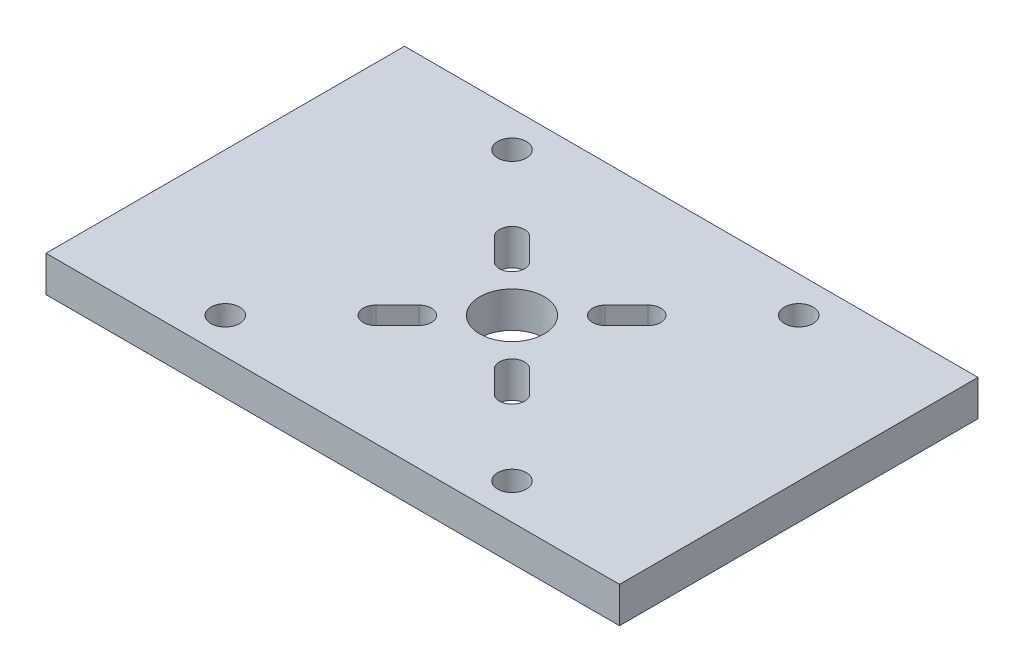
ISO-10303-21;
HEADER;
FILE_DESCRIPTION(('STEP AP214'),'2;1');
FILE_NAME('part.step','',(''),(''),'','','');
FILE_SCHEMA(('AUTOMOTIVE_DESIGN { 1 0 10303 214 1 1 1 1 }'));
ENDSEC;
DATA;
#1=APPLICATION_CONTEXT('core data for automotive mechanical design processes');
#2=APPLICATION_PROTOCOL_DEFINITION('international standard','automotive_design',2000,#1);
#3=PRODUCT_CONTEXT('',#1,'mechanical');
#4=PRODUCT('Part','Part','',(#3));
#5=PRODUCT_RELATED_PRODUCT_CATEGORY('part','',(#4));
#6=PRODUCT_DEFINITION_FORMATION('','',#4);
#7=PRODUCT_DEFINITION_CONTEXT('part definition',#1,'design');
#8=PRODUCT_DEFINITION('design','',#6,#7);
#9=PRODUCT_DEFINITION_SHAPE('','',#8);
#10=(LENGTH_UNIT() NAMED_UNIT(*) SI_UNIT(.MILLI.,.METRE.));
#11=(NAMED_UNIT(*) PLANE_ANGLE_UNIT() SI_UNIT($,.RADIAN.));
#12=(NAMED_UNIT(*) SI_UNIT($,.STERADIAN.) SOLID_ANGLE_UNIT());
#13=UNCERTAINTY_MEASURE_WITH_UNIT(LENGTH_MEASURE(1.E-05),#10,'distance_accuracy_value','');
#14=(GEOMETRIC_REPRESENTATION_CONTEXT(3) GLOBAL_UNCERTAINTY_ASSIGNED_CONTEXT((#13)) GLOBAL_UNIT_ASSIGNED_CONTEXT((#10,
#11,#12)) REPRESENTATION_CONTEXT('',''));
#15=CARTESIAN_POINT('',(0.,0.,0.));
#16=DIRECTION('',(0.,0.,1.));
#17=DIRECTION('',(1.,0.,0.));
#18=AXIS2_PLACEMENT_3D('',#15,#16,#17);
#19=CARTESIAN_POINT('',(0.,0.,0.));
#20=DIRECTION('',(0.,-1.,0.));
#21=DIRECTION('',(0.,0.,-1.));
#22=AXIS2_PLACEMENT_3D('',#19,#20,#21);
#23=PLANE('',#22);
#24=CARTESIAN_POINT('',(-40.,0.,-40.));
#25=DIRECTION('',(0.,-1.,0.));
#26=DIRECTION('',(0.,0.,-1.));
#27=AXIS2_PLACEMENT_3D('',#24,#25,#26);
#28=CIRCLE('',#27,4.);
#29=CARTESIAN_POINT('',(-40.,0.,-44.));
#30=VERTEX_POINT('',#29);
#31=EDGE_CURVE('E736',#30,#30,#28,.T.);
#32=ORIENTED_EDGE('',*,*,#31,.F.);
#33=EDGE_LOOP('',(#32));
#34=FACE_BOUND('',#33,.T.);
#35=CARTESIAN_POINT('',(40.,0.,-40.));
#36=DIRECTION('',(0.,-1.,0.));
#37=DIRECTION('',(0.,0.,-1.));
#38=AXIS2_PLACEMENT_3D('',#35,#36,#37);
#39=CIRCLE('',#38,4.);
#40=CARTESIAN_POINT('',(40.,0.,-44.));
#41=VERTEX_POINT('',#40);
#42=EDGE_CURVE('E738',#41,#41,#39,.T.);
#43=ORIENTED_EDGE('',*,*,#42,.F.);
#44=EDGE_LOOP('',(#43));
#45=FACE_BOUND('',#44,.T.);
#46=CARTESIAN_POINT('',(40.,0.,40.));
#47=DIRECTION('',(0.,-1.,0.));
#48=DIRECTION('',(0.,0.,-1.));
#49=AXIS2_PLACEMENT_3D('',#46,#47,#48);
#50=CIRCLE('',#49,4.);
#51=CARTESIAN_POINT('',(40.,0.,36.));
#52=VERTEX_POINT('',#51);
#53=EDGE_CURVE('E753',#52,#52,#50,.T.);
#54=ORIENTED_EDGE('',*,*,#53,.F.);
#55=EDGE_LOOP('',(#54));
#56=FACE_BOUND('',#55,.T.);
#57=CARTESIAN_POINT('',(-40.,0.,40.));
#58=DIRECTION('',(0.,-1.,0.));
#59=DIRECTION('',(0.,0.,-1.));
#60=AXIS2_PLACEMENT_3D('',#57,#58,#59);
#61=CIRCLE('',#60,4.);
#62=CARTESIAN_POINT('',(-40.,0.,36.));
#63=VERTEX_POINT('',#62);
#64=EDGE_CURVE('E744',#63,#63,#61,.T.);
#65=ORIENTED_EDGE('',*,*,#64,.F.);
#66=EDGE_LOOP('',(#65));
#67=FACE_BOUND('',#66,.T.);
#68=DIRECTION('',(0.707106781186549,0.,0.707106781186546));
#69=VECTOR('',#68,1.);
#70=CARTESIAN_POINT('',(-4.24264068711925,0.,4.24264068711926));
#71=LINE('',#70,#69);
#72=CARTESIAN_POINT('',(-23.2426406871193,0.,-14.7573593128807));
#73=VERTEX_POINT('',#72);
#74=CARTESIAN_POINT('',(-17.2426406871193,0.,-8.75735931288071));
#75=VERTEX_POINT('',#74);
#76=EDGE_CURVE('E433',#73,#75,#71,.T.);
#77=ORIENTED_EDGE('',*,*,#76,.T.);
#78=CARTESIAN_POINT('',(-13.,0.,-13.));
#79=DIRECTION('',(0.,-1.,0.));
#80=DIRECTION('',(0.,0.,-1.));
#81=AXIS2_PLACEMENT_3D('',#78,#79,#80);
#82=CIRCLE('',#81,6.);
#83=CARTESIAN_POINT('',(-8.75735931288069,0.,-17.2426406871193));
#84=VERTEX_POINT('',#83);
#85=EDGE_CURVE('E437',#75,#84,#82,.F.);
#86=ORIENTED_EDGE('',*,*,#85,.T.);
#87=DIRECTION('',(-0.707106781186548,0.,-0.707106781186548));
#88=VECTOR('',#87,1.);
#89=CARTESIAN_POINT('',(4.2426406871193,0.,-4.2426406871193));
#90=LINE('',#89,#88);
#91=CARTESIAN_POINT('',(-14.7573593128807,0.,-23.2426406871193));
#92=VERTEX_POINT('',#91);
#93=EDGE_CURVE('E425',#84,#92,#90,.T.);
#94=ORIENTED_EDGE('',*,*,#93,.T.);
#95=CARTESIAN_POINT('',(-19.,0.,-19.));
#96=DIRECTION('',(0.,-1.,0.));
#97=DIRECTION('',(0.,0.,-1.));
#98=AXIS2_PLACEMENT_3D('',#95,#96,#97);
#99=CIRCLE('',#98,6.00000000000001);
#100=EDGE_CURVE('E429',#92,#73,#99,.F.);
#101=ORIENTED_EDGE('',*,*,#100,.T.);
#102=EDGE_LOOP('',(#77,#86,#94,#101));
#103=FACE_BOUND('',#102,.T.);
#104=DIRECTION('',(0.707106781186548,0.,0.707106781186547));
#105=VECTOR('',#104,1.);
#106=CARTESIAN_POINT('',(-4.24264068711931,0.,4.24264068711931));
#107=LINE('',#106,#105);
#108=CARTESIAN_POINT('',(8.75735931288068,0.,17.2426406871193));
#109=VERTEX_POINT('',#108);
#110=CARTESIAN_POINT('',(14.7573593128807,0.,23.2426406871193));
#111=VERTEX_POINT('',#110);
#112=EDGE_CURVE('E403',#109,#111,#107,.T.);
#113=ORIENTED_EDGE('',*,*,#112,.T.);
#114=CARTESIAN_POINT('',(19.,0.,19.));
#115=DIRECTION('',(0.,-1.,0.));
#116=DIRECTION('',(0.,0.,-1.));
#117=AXIS2_PLACEMENT_3D('',#114,#115,#116);
#118=CIRCLE('',#117,6.);
#119=CARTESIAN_POINT('',(23.2426406871193,0.,14.7573593128807));
#120=VERTEX_POINT('',#119);
#121=EDGE_CURVE('E407',#111,#120,#118,.F.);
#122=ORIENTED_EDGE('',*,*,#121,.T.);
#123=DIRECTION('',(-0.707106781186548,0.,-0.707106781186548));
#124=VECTOR('',#123,1.);
#125=CARTESIAN_POINT('',(4.24264068711927,0.,-4.24264068711927));
#126=LINE('',#125,#124);
#127=CARTESIAN_POINT('',(17.2426406871193,0.,8.75735931288072));
#128=VERTEX_POINT('',#127);
#129=EDGE_CURVE('E387',#120,#128,#126,.T.);
#130=ORIENTED_EDGE('',*,*,#129,.T.);
#131=CARTESIAN_POINT('',(13.,0.,13.));
#132=DIRECTION('',(0.,-1.,0.));
#133=DIRECTION('',(0.,0.,-1.));
#134=AXIS2_PLACEMENT_3D('',#131,#132,#133);
#135=CIRCLE('',#134,6.00000000000001);
#136=EDGE_CURVE('E399',#128,#109,#135,.F.);
#137=ORIENTED_EDGE('',*,*,#136,.T.);
#138=EDGE_LOOP('',(#113,#122,#130,#137));
#139=FACE_BOUND('',#138,.T.);
#140=CARTESIAN_POINT('',(0.,0.,0.));
#141=DIRECTION('',(0.,-1.,0.));
#142=DIRECTION('',(0.,0.,-1.));
#143=AXIS2_PLACEMENT_3D('',#140,#141,#142);
#144=CIRCLE('',#143,9.);
#145=CARTESIAN_POINT('',(0.,0.,-9.));
#146=VERTEX_POINT('',#145);
#147=EDGE_CURVE('E362',#146,#146,#144,.T.);
#148=ORIENTED_EDGE('',*,*,#147,.F.);
#149=EDGE_LOOP('',(#148));
#150=FACE_BOUND('',#149,.T.);
#151=DIRECTION('',(0.,0.,1.));
#152=VECTOR('',#151,1.);
#153=CARTESIAN_POINT('',(80.,0.,-50.));
#154=LINE('',#153,#152);
#155=CARTESIAN_POINT('',(80.,0.,-50.));
#156=VERTEX_POINT('',#155);
#157=CARTESIAN_POINT('',(80.,0.,50.));
#158=VERTEX_POINT('',#157);
#159=EDGE_CURVE('E375',#156,#158,#154,.T.);
#160=ORIENTED_EDGE('',*,*,#159,.T.);
#161=DIRECTION('',(-1.,0.,0.));
#162=VECTOR('',#161,1.);
#163=CARTESIAN_POINT('',(80.,0.,50.));
#164=LINE('',#163,#162);
#165=CARTESIAN_POINT('',(-80.,0.,50.));
#166=VERTEX_POINT('',#165);
#167=EDGE_CURVE('E378',#158,#166,#164,.T.);
#168=ORIENTED_EDGE('',*,*,#167,.T.);
#169=DIRECTION('',(0.,0.,1.));
#170=VECTOR('',#169,1.);
#171=CARTESIAN_POINT('',(-80.,0.,-50.));
#172=LINE('',#171,#170);
#173=CARTESIAN_POINT('',(-80.,0.,-50.));
#174=VERTEX_POINT('',#173);
#175=EDGE_CURVE('E381',#174,#166,#172,.T.);
#176=ORIENTED_EDGE('',*,*,#175,.F.);
#177=DIRECTION('',(-1.,0.,0.));
#178=VECTOR('',#177,1.);
#179=CARTESIAN_POINT('',(80.,0.,-50.));
#180=LINE('',#179,#178);
#181=EDGE_CURVE('E367',#156,#174,#180,.T.);
#182=ORIENTED_EDGE('',*,*,#181,.F.);
#183=EDGE_LOOP('',(#160,#168,#176,#182));
#184=FACE_BOUND('',#183,.T.);
#185=DIRECTION('',(0.707106781186548,0.,-0.707106781186547));
#186=VECTOR('',#185,1.);
#187=CARTESIAN_POINT('',(4.24264068711932,0.,4.24264068711933));
#188=LINE('',#187,#186);
#189=CARTESIAN_POINT('',(-14.7573593128807,0.,23.2426406871193));
#190=VERTEX_POINT('',#189);
#191=CARTESIAN_POINT('',(-8.75735931288068,0.,17.2426406871193));
#192=VERTEX_POINT('',#191);
#193=EDGE_CURVE('E418',#190,#192,#188,.T.);
#194=ORIENTED_EDGE('',*,*,#193,.T.);
#195=CARTESIAN_POINT('',(-13.,0.,13.));
#196=DIRECTION('',(0.,-1.,0.));
#197=DIRECTION('',(0.,0.,-1.));
#198=AXIS2_PLACEMENT_3D('',#195,#196,#197);
#199=CIRCLE('',#198,6.00000000000001);
#200=CARTESIAN_POINT('',(-17.2426406871193,0.,8.75735931288071));
#201=VERTEX_POINT('',#200);
#202=EDGE_CURVE('E422',#192,#201,#199,.F.);
#203=ORIENTED_EDGE('',*,*,#202,.T.);
#204=DIRECTION('',(-0.707106781186547,0.,0.707106781186548));
#205=VECTOR('',#204,1.);
#206=CARTESIAN_POINT('',(-4.24264068711928,0.,-4.24264068711928));
#207=LINE('',#206,#205);
#208=CARTESIAN_POINT('',(-23.2426406871193,0.,14.7573593128807));
#209=VERTEX_POINT('',#208);
#210=EDGE_CURVE('E410',#201,#209,#207,.T.);
#211=ORIENTED_EDGE('',*,*,#210,.T.);
#212=CARTESIAN_POINT('',(-19.,0.,19.));
#213=DIRECTION('',(0.,-1.,0.));
#214=DIRECTION('',(0.,0.,-1.));
#215=AXIS2_PLACEMENT_3D('',#212,#213,#214);
#216=CIRCLE('',#215,6.);
#217=EDGE_CURVE('E414',#209,#190,#216,.F.);
#218=ORIENTED_EDGE('',*,*,#217,.T.);
#219=EDGE_LOOP('',(#194,#203,#211,#218));
#220=FACE_BOUND('',#219,.T.);
#221=DIRECTION('',(0.707106781186548,0.,-0.707106781186547));
#222=VECTOR('',#221,1.);
#223=CARTESIAN_POINT('',(4.24264068711927,0.,4.24264068711927));
#224=LINE('',#223,#222);
#225=CARTESIAN_POINT('',(17.2426406871193,0.,-8.75735931288072));
#226=VERTEX_POINT('',#225);
#227=CARTESIAN_POINT('',(23.2426406871193,0.,-14.7573593128807));
#228=VERTEX_POINT('',#227);
#229=EDGE_CURVE('E49',#226,#228,#224,.T.);
#230=ORIENTED_EDGE('',*,*,#229,.T.);
#231=CARTESIAN_POINT('',(19.,0.,-19.));
#232=DIRECTION('',(0.,-1.,0.));
#233=DIRECTION('',(0.,0.,-1.));
#234=AXIS2_PLACEMENT_3D('',#231,#232,#233);
#235=CIRCLE('',#234,6.00000000000001);
#236=CARTESIAN_POINT('',(14.7573593128807,0.,-23.2426406871193));
#237=VERTEX_POINT('',#236);
#238=EDGE_CURVE('E11',#228,#237,#235,.F.);
#239=ORIENTED_EDGE('',*,*,#238,.T.);
#240=DIRECTION('',(-0.707106781186547,0.,0.707106781186548));
#241=VECTOR('',#240,1.);
#242=CARTESIAN_POINT('',(-4.2426406871193,0.,-4.2426406871193));
#243=LINE('',#242,#241);
#244=CARTESIAN_POINT('',(8.75735931288068,0.,-17.2426406871193));
#245=VERTEX_POINT('',#244);
#246=EDGE_CURVE('E440',#237,#245,#243,.T.);
#247=ORIENTED_EDGE('',*,*,#246,.T.);
#248=CARTESIAN_POINT('',(13.,0.,-13.));
#249=DIRECTION('',(0.,-1.,0.));
#250=DIRECTION('',(0.,0.,-1.));
#251=AXIS2_PLACEMENT_3D('',#248,#249,#250);
#252=CIRCLE('',#251,6.00000000000001);
#253=EDGE_CURVE('E444',#245,#226,#252,.F.);
#254=ORIENTED_EDGE('',*,*,#253,.T.);
#255=EDGE_LOOP('',(#230,#239,#247,#254));
#256=FACE_BOUND('',#255,.T.);
#257=ADVANCED_FACE('F40',(#34,#45,#56,#67,#103,#139,#150,#184,#220,#256),#23,.T.);
#258=ORIENTED_EDGE('',*,*,#238,.F.);
#259=ORIENTED_EDGE('',*,*,#229,.F.);
#260=ORIENTED_EDGE('',*,*,#253,.F.);
#261=ORIENTED_EDGE('',*,*,#246,.F.);
#262=EDGE_LOOP('',(#258,#259,#260,#261));
#263=FACE_BOUND('',#262,.T.);
#264=CARTESIAN_POINT('',(19.,0.,-19.));
#265=DIRECTION('',(0.,-1.,0.));
#266=DIRECTION('',(0.,0.,-1.));
#267=AXIS2_PLACEMENT_3D('',#264,#265,#266);
#268=CIRCLE('',#267,3.50000000000001);
#269=CARTESIAN_POINT('',(21.4748737341529,0.,-16.5251262658471));
#270=VERTEX_POINT('',#269);
#271=CARTESIAN_POINT('',(16.5251262658471,0.,-21.4748737341529));
#272=VERTEX_POINT('',#271);
#273=EDGE_CURVE('E270',#270,#272,#268,.F.);
#274=ORIENTED_EDGE('',*,*,#273,.T.);
#275=DIRECTION('',(-0.707106781186547,0.,0.707106781186548));
#276=VECTOR('',#275,1.);
#277=CARTESIAN_POINT('',(16.5251262658471,0.,-21.4748737341529));
#278=LINE('',#277,#276);
#279=CARTESIAN_POINT('',(10.5251262658471,0.,-15.4748737341529));
#280=VERTEX_POINT('',#279);
#281=EDGE_CURVE('E287',#272,#280,#278,.T.);
#282=ORIENTED_EDGE('',*,*,#281,.T.);
#283=CARTESIAN_POINT('',(13.,0.,-13.));
#284=DIRECTION('',(0.,-1.,0.));
#285=DIRECTION('',(0.,0.,-1.));
#286=AXIS2_PLACEMENT_3D('',#283,#284,#285);
#287=CIRCLE('',#286,3.5);
#288=CARTESIAN_POINT('',(15.4748737341529,0.,-10.5251262658471));
#289=VERTEX_POINT('',#288);
#290=EDGE_CURVE('E263',#280,#289,#287,.F.);
#291=ORIENTED_EDGE('',*,*,#290,.T.);
#292=DIRECTION('',(0.707106781186547,0.,-0.707106781186548));
#293=VECTOR('',#292,1.);
#294=CARTESIAN_POINT('',(21.4748737341529,0.,-16.5251262658471));
#295=LINE('',#294,#293);
#296=EDGE_CURVE('E266',#289,#270,#295,.T.);
#297=ORIENTED_EDGE('',*,*,#296,.T.);
#298=EDGE_LOOP('',(#274,#282,#291,#297));
#299=FACE_BOUND('',#298,.T.);
#300=ADVANCED_FACE('F450',(#263,#299),#23,.T.);
#301=ORIENTED_EDGE('',*,*,#85,.F.);
#302=ORIENTED_EDGE('',*,*,#76,.F.);
#303=ORIENTED_EDGE('',*,*,#100,.F.);
#304=ORIENTED_EDGE('',*,*,#93,.F.);
#305=EDGE_LOOP('',(#301,#302,#303,#304));
#306=FACE_BOUND('',#305,.T.);
#307=CARTESIAN_POINT('',(-19.,0.,-19.));
#308=DIRECTION('',(0.,-1.,0.));
#309=DIRECTION('',(0.,0.,-1.));
#310=AXIS2_PLACEMENT_3D('',#307,#308,#309);
#311=CIRCLE('',#310,3.50000000000001);
#312=CARTESIAN_POINT('',(-16.5251262658471,0.,-21.4748737341529));
#313=VERTEX_POINT('',#312);
#314=CARTESIAN_POINT('',(-21.4748737341529,0.,-16.5251262658471));
#315=VERTEX_POINT('',#314);
#316=EDGE_CURVE('E303',#313,#315,#311,.F.);
#317=ORIENTED_EDGE('',*,*,#316,.T.);
#318=DIRECTION('',(0.707106781186547,0.,0.707106781186548));
#319=VECTOR('',#318,1.);
#320=CARTESIAN_POINT('',(-21.4748737341529,0.,-16.5251262658471));
#321=LINE('',#320,#319);
#322=CARTESIAN_POINT('',(-15.4748737341529,0.,-10.5251262658471));
#323=VERTEX_POINT('',#322);
#324=EDGE_CURVE('E267',#315,#323,#321,.T.);
#325=ORIENTED_EDGE('',*,*,#324,.T.);
#326=CARTESIAN_POINT('',(-13.,0.,-13.));
#327=DIRECTION('',(0.,-1.,0.));
#328=DIRECTION('',(0.,0.,-1.));
#329=AXIS2_PLACEMENT_3D('',#326,#327,#328);
#330=CIRCLE('',#329,3.5);
#331=CARTESIAN_POINT('',(-10.5251262658471,0.,-15.4748737341529));
#332=VERTEX_POINT('',#331);
#333=EDGE_CURVE('E296',#323,#332,#330,.F.);
#334=ORIENTED_EDGE('',*,*,#333,.T.);
#335=DIRECTION('',(-0.707106781186547,0.,-0.707106781186548));
#336=VECTOR('',#335,1.);
#337=CARTESIAN_POINT('',(-16.5251262658471,0.,-21.4748737341529));
#338=LINE('',#337,#336);
#339=EDGE_CURVE('E299',#332,#313,#338,.T.);
#340=ORIENTED_EDGE('',*,*,#339,.T.);
#341=EDGE_LOOP('',(#317,#325,#334,#340));
#342=FACE_BOUND('',#341,.T.);
#343=ADVANCED_FACE('F453',(#306,#342),#23,.T.);
#344=ORIENTED_EDGE('',*,*,#202,.F.);
#345=ORIENTED_EDGE('',*,*,#193,.F.);
#346=ORIENTED_EDGE('',*,*,#217,.F.);
#347=ORIENTED_EDGE('',*,*,#210,.F.);
#348=EDGE_LOOP('',(#344,#345,#346,#347));
#349=FACE_BOUND('',#348,.T.);
#350=CARTESIAN_POINT('',(-19.,0.,19.));
#351=DIRECTION('',(0.,-1.,0.));
#352=DIRECTION('',(0.,0.,-1.));
#353=AXIS2_PLACEMENT_3D('',#350,#351,#352);
#354=CIRCLE('',#353,3.50000000000001);
#355=CARTESIAN_POINT('',(-21.4748737341529,0.,16.5251262658471));
#356=VERTEX_POINT('',#355);
#357=CARTESIAN_POINT('',(-16.5251262658471,0.,21.4748737341529));
#358=VERTEX_POINT('',#357);
#359=EDGE_CURVE('E333',#356,#358,#354,.F.);
#360=ORIENTED_EDGE('',*,*,#359,.T.);
#361=DIRECTION('',(0.707106781186547,0.,-0.707106781186548));
#362=VECTOR('',#361,1.);
#363=CARTESIAN_POINT('',(-16.5251262658471,0.,21.4748737341529));
#364=LINE('',#363,#362);
#365=CARTESIAN_POINT('',(-10.5251262658471,0.,15.4748737341529));
#366=VERTEX_POINT('',#365);
#367=EDGE_CURVE('E350',#358,#366,#364,.T.);
#368=ORIENTED_EDGE('',*,*,#367,.T.);
#369=CARTESIAN_POINT('',(-13.,0.,13.));
#370=DIRECTION('',(0.,-1.,0.));
#371=DIRECTION('',(0.,0.,-1.));
#372=AXIS2_PLACEMENT_3D('',#369,#370,#371);
#373=CIRCLE('',#372,3.5);
#374=CARTESIAN_POINT('',(-15.4748737341529,0.,10.5251262658471));
#375=VERTEX_POINT('',#374);
#376=EDGE_CURVE('E232',#366,#375,#373,.F.);
#377=ORIENTED_EDGE('',*,*,#376,.T.);
#378=DIRECTION('',(-0.707106781186547,0.,0.707106781186548));
#379=VECTOR('',#378,1.);
#380=CARTESIAN_POINT('',(-21.4748737341529,0.,16.5251262658471));
#381=LINE('',#380,#379);
#382=EDGE_CURVE('E330',#375,#356,#381,.T.);
#383=ORIENTED_EDGE('',*,*,#382,.T.);
#384=EDGE_LOOP('',(#360,#368,#377,#383));
#385=FACE_BOUND('',#384,.T.);
#386=ADVANCED_FACE('F496',(#349,#385),#23,.T.);
#387=CARTESIAN_POINT('',(80.,10.,-50.));
#388=DIRECTION('',(1.,0.,0.));
#389=DIRECTION('',(0.,0.,-1.));
#390=AXIS2_PLACEMENT_3D('',#387,#388,#389);
#391=PLANE('',#390);
#392=ORIENTED_EDGE('',*,*,#159,.F.);
#393=DIRECTION('',(0.,-1.,0.));
#394=VECTOR('',#393,1.);
#395=CARTESIAN_POINT('',(80.,10.,-50.));
#396=LINE('',#395,#394);
#397=CARTESIAN_POINT('',(80.,10.,-50.));
#398=VERTEX_POINT('',#397);
#399=EDGE_CURVE('E385',#398,#156,#396,.T.);
#400=ORIENTED_EDGE('',*,*,#399,.F.);
#401=DIRECTION('',(0.,0.,1.));
#402=VECTOR('',#401,1.);
#403=CARTESIAN_POINT('',(80.,10.,-50.));
#404=LINE('',#403,#402);
#405=CARTESIAN_POINT('',(80.,10.,50.));
#406=VERTEX_POINT('',#405);
#407=EDGE_CURVE('E363',#398,#406,#404,.T.);
#408=ORIENTED_EDGE('',*,*,#407,.T.);
#409=DIRECTION('',(0.,-1.,0.));
#410=VECTOR('',#409,1.);
#411=CARTESIAN_POINT('',(80.,10.,50.));
#412=LINE('',#411,#410);
#413=EDGE_CURVE('E374',#406,#158,#412,.T.);
#414=ORIENTED_EDGE('',*,*,#413,.T.);
#415=EDGE_LOOP('',(#392,#400,#408,#414));
#416=FACE_BOUND('',#415,.T.);
#417=ADVANCED_FACE('F42',(#416),#391,.T.);
#418=CARTESIAN_POINT('',(80.,10.,-50.));
#419=DIRECTION('',(0.,0.,1.));
#420=DIRECTION('',(1.,0.,0.));
#421=AXIS2_PLACEMENT_3D('',#418,#419,#420);
#422=PLANE('',#421);
#423=ORIENTED_EDGE('',*,*,#181,.T.);
#424=DIRECTION('',(0.,-1.,0.));
#425=VECTOR('',#424,1.);
#426=CARTESIAN_POINT('',(-80.,10.,-50.));
#427=LINE('',#426,#425);
#428=CARTESIAN_POINT('',(-80.,10.,-50.));
#429=VERTEX_POINT('',#428);
#430=EDGE_CURVE('E388',#429,#174,#427,.T.);
#431=ORIENTED_EDGE('',*,*,#430,.F.);
#432=DIRECTION('',(-1.,0.,0.));
#433=VECTOR('',#432,1.);
#434=CARTESIAN_POINT('',(80.,10.,-50.));
#435=LINE('',#434,#433);
#436=EDGE_CURVE('E372',#398,#429,#435,.T.);
#437=ORIENTED_EDGE('',*,*,#436,.F.);
#438=ORIENTED_EDGE('',*,*,#399,.T.);
#439=EDGE_LOOP('',(#423,#431,#437,#438));
#440=FACE_BOUND('',#439,.T.);
#441=ADVANCED_FACE('F511',(#440),#422,.F.);
#442=CARTESIAN_POINT('',(-80.,10.,-50.));
#443=DIRECTION('',(1.,0.,0.));
#444=DIRECTION('',(0.,0.,-1.));
#445=AXIS2_PLACEMENT_3D('',#442,#443,#444);
#446=PLANE('',#445);
#447=ORIENTED_EDGE('',*,*,#175,.T.);
#448=DIRECTION('',(0.,-1.,0.));
#449=VECTOR('',#448,1.);
#450=CARTESIAN_POINT('',(-80.,10.,50.));
#451=LINE('',#450,#449);
#452=CARTESIAN_POINT('',(-80.,10.,50.));
#453=VERTEX_POINT('',#452);
#454=EDGE_CURVE('E391',#453,#166,#451,.T.);
#455=ORIENTED_EDGE('',*,*,#454,.F.);
#456=DIRECTION('',(0.,0.,1.));
#457=VECTOR('',#456,1.);
#458=CARTESIAN_POINT('',(-80.,10.,-50.));
#459=LINE('',#458,#457);
#460=EDGE_CURVE('E370',#429,#453,#459,.T.);
#461=ORIENTED_EDGE('',*,*,#460,.F.);
#462=ORIENTED_EDGE('',*,*,#430,.T.);
#463=EDGE_LOOP('',(#447,#455,#461,#462));
#464=FACE_BOUND('',#463,.T.);
#465=ADVANCED_FACE('F785',(#464),#446,.F.);
#466=CARTESIAN_POINT('',(80.,10.,50.));
#467=DIRECTION('',(0.,0.,1.));
#468=DIRECTION('',(1.,0.,0.));
#469=AXIS2_PLACEMENT_3D('',#466,#467,#468);
#470=PLANE('',#469);
#471=ORIENTED_EDGE('',*,*,#167,.F.);
#472=ORIENTED_EDGE('',*,*,#413,.F.);
#473=DIRECTION('',(-1.,0.,0.));
#474=VECTOR('',#473,1.);
#475=CARTESIAN_POINT('',(80.,10.,50.));
#476=LINE('',#475,#474);
#477=EDGE_CURVE('E366',#406,#453,#476,.T.);
#478=ORIENTED_EDGE('',*,*,#477,.T.);
#479=ORIENTED_EDGE('',*,*,#454,.T.);
#480=EDGE_LOOP('',(#471,#472,#478,#479));
#481=FACE_BOUND('',#480,.T.);
#482=ADVANCED_FACE('F503',(#481),#470,.T.);
#483=CARTESIAN_POINT('',(0.,10.,0.));
#484=DIRECTION('',(0.,-1.,0.));
#485=DIRECTION('',(0.,0.,-1.));
#486=AXIS2_PLACEMENT_3D('',#483,#484,#485);
#487=PLANE('',#486);
#488=CARTESIAN_POINT('',(-40.,10.,-40.));
#489=DIRECTION('',(0.,-1.,0.));
#490=DIRECTION('',(0.,0.,-1.));
#491=AXIS2_PLACEMENT_3D('',#488,#489,#490);
#492=CIRCLE('',#491,4.);
#493=CARTESIAN_POINT('',(-40.,10.,-44.));
#494=VERTEX_POINT('',#493);
#495=EDGE_CURVE('E734',#494,#494,#492,.T.);
#496=ORIENTED_EDGE('',*,*,#495,.T.);
#497=EDGE_LOOP('',(#496));
#498=FACE_BOUND('',#497,.T.);
#499=CARTESIAN_POINT('',(40.,10.,-40.));
#500=DIRECTION('',(0.,-1.,0.));
#501=DIRECTION('',(0.,0.,-1.));
#502=AXIS2_PLACEMENT_3D('',#499,#500,#501);
#503=CIRCLE('',#502,4.);
#504=CARTESIAN_POINT('',(40.,10.,-44.));
#505=VERTEX_POINT('',#504);
#506=EDGE_CURVE('E758',#505,#505,#503,.T.);
#507=ORIENTED_EDGE('',*,*,#506,.T.);
#508=EDGE_LOOP('',(#507));
#509=FACE_BOUND('',#508,.T.);
#510=CARTESIAN_POINT('',(40.,10.,40.));
#511=DIRECTION('',(0.,-1.,0.));
#512=DIRECTION('',(0.,0.,-1.));
#513=AXIS2_PLACEMENT_3D('',#510,#511,#512);
#514=CIRCLE('',#513,4.);
#515=CARTESIAN_POINT('',(40.,10.,36.));
#516=VERTEX_POINT('',#515);
#517=EDGE_CURVE('E746',#516,#516,#514,.T.);
#518=ORIENTED_EDGE('',*,*,#517,.T.);
#519=EDGE_LOOP('',(#518));
#520=FACE_BOUND('',#519,.T.);
#521=CARTESIAN_POINT('',(-40.,10.,40.));
#522=DIRECTION('',(0.,-1.,0.));
#523=DIRECTION('',(0.,0.,-1.));
#524=AXIS2_PLACEMENT_3D('',#521,#522,#523);
#525=CIRCLE('',#524,4.);
#526=CARTESIAN_POINT('',(-40.,10.,36.));
#527=VERTEX_POINT('',#526);
#528=EDGE_CURVE('E300',#527,#527,#525,.T.);
#529=ORIENTED_EDGE('',*,*,#528,.T.);
#530=EDGE_LOOP('',(#529));
#531=FACE_BOUND('',#530,.T.);
#532=DIRECTION('',(0.707106781186547,0.,0.707106781186548));
#533=VECTOR('',#532,1.);
#534=CARTESIAN_POINT('',(-21.4748737341529,10.,-16.5251262658471));
#535=LINE('',#534,#533);
#536=CARTESIAN_POINT('',(-21.4748737341529,10.,-16.5251262658471));
#537=VERTEX_POINT('',#536);
#538=CARTESIAN_POINT('',(-15.4748737341529,10.,-10.5251262658471));
#539=VERTEX_POINT('',#538);
#540=EDGE_CURVE('E308',#537,#539,#535,.T.);
#541=ORIENTED_EDGE('',*,*,#540,.F.);
#542=CARTESIAN_POINT('',(-19.,10.,-19.));
#543=DIRECTION('',(0.,1.,0.));
#544=DIRECTION('',(0.,0.,-1.));
#545=AXIS2_PLACEMENT_3D('',#542,#543,#544);
#546=CIRCLE('',#545,3.50000000000001);
#547=CARTESIAN_POINT('',(-16.5251262658471,10.,-21.4748737341529));
#548=VERTEX_POINT('',#547);
#549=EDGE_CURVE('E306',#548,#537,#546,.T.);
#550=ORIENTED_EDGE('',*,*,#549,.F.);
#551=DIRECTION('',(-0.707106781186547,0.,-0.707106781186548));
#552=VECTOR('',#551,1.);
#553=CARTESIAN_POINT('',(-16.5251262658471,10.,-21.4748737341529));
#554=LINE('',#553,#552);
#555=CARTESIAN_POINT('',(-10.5251262658471,10.,-15.4748737341529));
#556=VERTEX_POINT('',#555);
#557=EDGE_CURVE('E314',#556,#548,#554,.T.);
#558=ORIENTED_EDGE('',*,*,#557,.F.);
#559=CARTESIAN_POINT('',(-13.,10.,-13.));
#560=DIRECTION('',(0.,1.,0.));
#561=DIRECTION('',(0.,0.,-1.));
#562=AXIS2_PLACEMENT_3D('',#559,#560,#561);
#563=CIRCLE('',#562,3.5);
#564=EDGE_CURVE('E311',#539,#556,#563,.T.);
#565=ORIENTED_EDGE('',*,*,#564,.F.);
#566=EDGE_LOOP('',(#541,#550,#558,#565));
#567=FACE_BOUND('',#566,.T.);
#568=DIRECTION('',(-0.707106781186547,0.,0.707106781186548));
#569=VECTOR('',#568,1.);
#570=CARTESIAN_POINT('',(16.5251262658471,10.,-21.4748737341529));
#571=LINE('',#570,#569);
#572=CARTESIAN_POINT('',(16.5251262658471,10.,-21.4748737341529));
#573=VERTEX_POINT('',#572);
#574=CARTESIAN_POINT('',(10.5251262658471,10.,-15.4748737341529));
#575=VERTEX_POINT('',#574);
#576=EDGE_CURVE('E275',#573,#575,#571,.T.);
#577=ORIENTED_EDGE('',*,*,#576,.F.);
#578=CARTESIAN_POINT('',(19.,10.,-19.));
#579=DIRECTION('',(0.,1.,0.));
#580=DIRECTION('',(0.,0.,1.));
#581=AXIS2_PLACEMENT_3D('',#578,#579,#580);
#582=CIRCLE('',#581,3.50000000000001);
#583=CARTESIAN_POINT('',(21.4748737341529,10.,-16.5251262658471));
#584=VERTEX_POINT('',#583);
#585=EDGE_CURVE('E273',#584,#573,#582,.T.);
#586=ORIENTED_EDGE('',*,*,#585,.F.);
#587=DIRECTION('',(0.707106781186547,0.,-0.707106781186548));
#588=VECTOR('',#587,1.);
#589=CARTESIAN_POINT('',(21.4748737341529,10.,-16.5251262658471));
#590=LINE('',#589,#588);
#591=CARTESIAN_POINT('',(15.4748737341529,10.,-10.5251262658471));
#592=VERTEX_POINT('',#591);
#593=EDGE_CURVE('E281',#592,#584,#590,.T.);
#594=ORIENTED_EDGE('',*,*,#593,.F.);
#595=CARTESIAN_POINT('',(13.,10.,-13.));
#596=DIRECTION('',(0.,1.,0.));
#597=DIRECTION('',(0.,0.,1.));
#598=AXIS2_PLACEMENT_3D('',#595,#596,#597);
#599=CIRCLE('',#598,3.5);
#600=EDGE_CURVE('E278',#575,#592,#599,.T.);
#601=ORIENTED_EDGE('',*,*,#600,.F.);
#602=EDGE_LOOP('',(#577,#586,#594,#601));
#603=FACE_BOUND('',#602,.T.);
#604=DIRECTION('',(-0.707106781186547,0.,-0.707106781186548));
#605=VECTOR('',#604,1.);
#606=CARTESIAN_POINT('',(21.4748737341529,10.,16.5251262658471));
#607=LINE('',#606,#605);
#608=CARTESIAN_POINT('',(21.4748737341529,10.,16.5251262658471));
#609=VERTEX_POINT('',#608);
#610=CARTESIAN_POINT('',(15.4748737341529,10.,10.5251262658471));
#611=VERTEX_POINT('',#610);
#612=EDGE_CURVE('E247',#609,#611,#607,.T.);
#613=ORIENTED_EDGE('',*,*,#612,.F.);
#614=CARTESIAN_POINT('',(19.,10.,19.));
#615=DIRECTION('',(0.,1.,0.));
#616=DIRECTION('',(0.,0.,-1.));
#617=AXIS2_PLACEMENT_3D('',#614,#615,#616);
#618=CIRCLE('',#617,3.50000000000001);
#619=CARTESIAN_POINT('',(16.5251262658471,10.,21.4748737341529));
#620=VERTEX_POINT('',#619);
#621=EDGE_CURVE('E240',#620,#609,#618,.T.);
#622=ORIENTED_EDGE('',*,*,#621,.F.);
#623=DIRECTION('',(0.707106781186547,0.,0.707106781186548));
#624=VECTOR('',#623,1.);
#625=CARTESIAN_POINT('',(16.5251262658471,10.,21.4748737341529));
#626=LINE('',#625,#624);
#627=CARTESIAN_POINT('',(10.5251262658471,10.,15.4748737341529));
#628=VERTEX_POINT('',#627);
#629=EDGE_CURVE('E241',#628,#620,#626,.T.);
#630=ORIENTED_EDGE('',*,*,#629,.F.);
#631=CARTESIAN_POINT('',(13.,10.,13.));
#632=DIRECTION('',(0.,1.,0.));
#633=DIRECTION('',(0.,0.,-1.));
#634=AXIS2_PLACEMENT_3D('',#631,#632,#633);
#635=CIRCLE('',#634,3.5);
#636=EDGE_CURVE('E254',#611,#628,#635,.T.);
#637=ORIENTED_EDGE('',*,*,#636,.F.);
#638=EDGE_LOOP('',(#613,#622,#630,#637));
#639=FACE_BOUND('',#638,.T.);
#640=DIRECTION('',(0.707106781186547,0.,-0.707106781186548));
#641=VECTOR('',#640,1.);
#642=CARTESIAN_POINT('',(-16.5251262658471,10.,21.4748737341529));
#643=LINE('',#642,#641);
#644=CARTESIAN_POINT('',(-16.5251262658471,10.,21.4748737341529));
#645=VERTEX_POINT('',#644);
#646=CARTESIAN_POINT('',(-10.5251262658471,10.,15.4748737341529));
#647=VERTEX_POINT('',#646);
#648=EDGE_CURVE('E338',#645,#647,#643,.T.);
#649=ORIENTED_EDGE('',*,*,#648,.F.);
#650=CARTESIAN_POINT('',(-19.,10.,19.));
#651=DIRECTION('',(0.,1.,0.));
#652=DIRECTION('',(0.,0.,1.));
#653=AXIS2_PLACEMENT_3D('',#650,#651,#652);
#654=CIRCLE('',#653,3.50000000000001);
#655=CARTESIAN_POINT('',(-21.4748737341529,10.,16.5251262658471));
#656=VERTEX_POINT('',#655);
#657=EDGE_CURVE('E336',#656,#645,#654,.T.);
#658=ORIENTED_EDGE('',*,*,#657,.F.);
#659=DIRECTION('',(-0.707106781186547,0.,0.707106781186548));
#660=VECTOR('',#659,1.);
#661=CARTESIAN_POINT('',(-21.4748737341529,10.,16.5251262658471));
#662=LINE('',#661,#660);
#663=CARTESIAN_POINT('',(-15.4748737341529,10.,10.5251262658471));
#664=VERTEX_POINT('',#663);
#665=EDGE_CURVE('E344',#664,#656,#662,.T.);
#666=ORIENTED_EDGE('',*,*,#665,.F.);
#667=CARTESIAN_POINT('',(-13.,10.,13.));
#668=DIRECTION('',(0.,1.,0.));
#669=DIRECTION('',(0.,0.,1.));
#670=AXIS2_PLACEMENT_3D('',#667,#668,#669);
#671=CIRCLE('',#670,3.5);
#672=EDGE_CURVE('E341',#647,#664,#671,.T.);
#673=ORIENTED_EDGE('',*,*,#672,.F.);
#674=EDGE_LOOP('',(#649,#658,#666,#673));
#675=FACE_BOUND('',#674,.T.);
#676=CARTESIAN_POINT('',(0.,10.,0.));
#677=DIRECTION('',(0.,1.,0.));
#678=DIRECTION('',(0.,0.,1.));
#679=AXIS2_PLACEMENT_3D('',#676,#677,#678);
#680=CIRCLE('',#679,9.);
#681=CARTESIAN_POINT('',(0.,10.,9.));
#682=VERTEX_POINT('',#681);
#683=EDGE_CURVE('E359',#682,#682,#680,.T.);
#684=ORIENTED_EDGE('',*,*,#683,.F.);
#685=EDGE_LOOP('',(#684));
#686=FACE_BOUND('',#685,.T.);
#687=ORIENTED_EDGE('',*,*,#407,.F.);
#688=ORIENTED_EDGE('',*,*,#436,.T.);
#689=ORIENTED_EDGE('',*,*,#460,.T.);
#690=ORIENTED_EDGE('',*,*,#477,.F.);
#691=EDGE_LOOP('',(#687,#688,#689,#690));
#692=FACE_BOUND('',#691,.T.);
#693=ADVANCED_FACE('F467',(#498,#509,#520,#531,#567,#603,#639,#675,#686,#692),#487,.F.);
#694=ORIENTED_EDGE('',*,*,#121,.F.);
#695=ORIENTED_EDGE('',*,*,#112,.F.);
#696=ORIENTED_EDGE('',*,*,#136,.F.);
#697=ORIENTED_EDGE('',*,*,#129,.F.);
#698=EDGE_LOOP('',(#694,#695,#696,#697));
#699=FACE_BOUND('',#698,.T.);
#700=CARTESIAN_POINT('',(19.,0.,19.));
#701=DIRECTION('',(0.,-1.,0.));
#702=DIRECTION('',(0.,0.,-1.));
#703=AXIS2_PLACEMENT_3D('',#700,#701,#702);
#704=CIRCLE('',#703,3.50000000000001);
#705=CARTESIAN_POINT('',(16.5251262658471,0.,21.4748737341529));
#706=VERTEX_POINT('',#705);
#707=CARTESIAN_POINT('',(21.4748737341529,0.,16.5251262658471));
#708=VERTEX_POINT('',#707);
#709=EDGE_CURVE('E237',#706,#708,#704,.F.);
#710=ORIENTED_EDGE('',*,*,#709,.T.);
#711=DIRECTION('',(-0.707106781186547,0.,-0.707106781186548));
#712=VECTOR('',#711,1.);
#713=CARTESIAN_POINT('',(21.4748737341529,0.,16.5251262658471));
#714=LINE('',#713,#712);
#715=CARTESIAN_POINT('',(15.4748737341529,0.,10.5251262658471));
#716=VERTEX_POINT('',#715);
#717=EDGE_CURVE('E221',#708,#716,#714,.T.);
#718=ORIENTED_EDGE('',*,*,#717,.T.);
#719=CARTESIAN_POINT('',(13.,0.,13.));
#720=DIRECTION('',(0.,-1.,0.));
#721=DIRECTION('',(0.,0.,-1.));
#722=AXIS2_PLACEMENT_3D('',#719,#720,#721);
#723=CIRCLE('',#722,3.5);
#724=CARTESIAN_POINT('',(10.5251262658471,0.,15.4748737341529));
#725=VERTEX_POINT('',#724);
#726=EDGE_CURVE('E249',#716,#725,#723,.F.);
#727=ORIENTED_EDGE('',*,*,#726,.T.);
#728=DIRECTION('',(0.707106781186547,0.,0.707106781186548));
#729=VECTOR('',#728,1.);
#730=CARTESIAN_POINT('',(16.5251262658471,0.,21.4748737341529));
#731=LINE('',#730,#729);
#732=EDGE_CURVE('E245',#725,#706,#731,.T.);
#733=ORIENTED_EDGE('',*,*,#732,.T.);
#734=EDGE_LOOP('',(#710,#718,#727,#733));
#735=FACE_BOUND('',#734,.T.);
#736=ADVANCED_FACE('F244',(#699,#735),#23,.T.);
#737=CARTESIAN_POINT('',(0.,-30.,0.));
#738=DIRECTION('',(0.,1.,0.));
#739=DIRECTION('',(0.,0.,1.));
#740=AXIS2_PLACEMENT_3D('',#737,#738,#739);
#741=CYLINDRICAL_SURFACE('',#740,9.);
#742=ORIENTED_EDGE('',*,*,#147,.T.);
#743=EDGE_LOOP('',(#742));
#744=FACE_BOUND('',#743,.T.);
#745=ORIENTED_EDGE('',*,*,#683,.T.);
#746=EDGE_LOOP('',(#745));
#747=FACE_BOUND('',#746,.T.);
#748=ADVANCED_FACE('F494',(#744,#747),#741,.F.);
#749=CARTESIAN_POINT('',(-19.,-0.000999999999999265,19.));
#750=DIRECTION('',(0.,1.,0.));
#751=DIRECTION('',(0.,0.,1.));
#752=AXIS2_PLACEMENT_3D('',#749,#750,#751);
#753=CYLINDRICAL_SURFACE('',#752,3.50000000000001);
#754=DIRECTION('',(0.,1.,0.));
#755=VECTOR('',#754,1.);
#756=CARTESIAN_POINT('',(-21.4748737341529,-0.000999999999999265,16.5251262658471));
#757=LINE('',#756,#755);
#758=EDGE_CURVE('E348',#356,#656,#757,.T.);
#759=ORIENTED_EDGE('',*,*,#758,.T.);
#760=ORIENTED_EDGE('',*,*,#657,.T.);
#761=DIRECTION('',(0.,1.,0.));
#762=VECTOR('',#761,1.);
#763=CARTESIAN_POINT('',(-16.5251262658471,-0.000999999999999265,21.4748737341529));
#764=LINE('',#763,#762);
#765=EDGE_CURVE('E347',#358,#645,#764,.T.);
#766=ORIENTED_EDGE('',*,*,#765,.F.);
#767=ORIENTED_EDGE('',*,*,#359,.F.);
#768=EDGE_LOOP('',(#759,#760,#766,#767));
#769=FACE_BOUND('',#768,.T.);
#770=ADVANCED_FACE('F500',(#769),#753,.F.);
#771=CARTESIAN_POINT('',(-21.4748737341529,-0.000999999999999265,16.5251262658471));
#772=DIRECTION('',(-0.707106781186548,0.,-0.707106781186547));
#773=DIRECTION('',(-0.707106781186547,0.,0.707106781186548));
#774=AXIS2_PLACEMENT_3D('',#771,#772,#773);
#775=PLANE('',#774);
#776=DIRECTION('',(0.,1.,0.));
#777=VECTOR('',#776,1.);
#778=CARTESIAN_POINT('',(-15.4748737341529,-0.000999999999999265,10.5251262658471));
#779=LINE('',#778,#777);
#780=EDGE_CURVE('E351',#375,#664,#779,.T.);
#781=ORIENTED_EDGE('',*,*,#780,.T.);
#782=ORIENTED_EDGE('',*,*,#665,.T.);
#783=ORIENTED_EDGE('',*,*,#758,.F.);
#784=ORIENTED_EDGE('',*,*,#382,.F.);
#785=EDGE_LOOP('',(#781,#782,#783,#784));
#786=FACE_BOUND('',#785,.T.);
#787=ADVANCED_FACE('F520',(#786),#775,.F.);
#788=CARTESIAN_POINT('',(-13.,-0.000999999999999265,13.));
#789=DIRECTION('',(0.,1.,0.));
#790=DIRECTION('',(0.,0.,1.));
#791=AXIS2_PLACEMENT_3D('',#788,#789,#790);
#792=CYLINDRICAL_SURFACE('',#791,3.5);
#793=DIRECTION('',(0.,1.,0.));
#794=VECTOR('',#793,1.);
#795=CARTESIAN_POINT('',(-10.5251262658471,-0.000999999999999265,15.4748737341529));
#796=LINE('',#795,#794);
#797=EDGE_CURVE('E353',#366,#647,#796,.T.);
#798=ORIENTED_EDGE('',*,*,#797,.T.);
#799=ORIENTED_EDGE('',*,*,#672,.T.);
#800=ORIENTED_EDGE('',*,*,#780,.F.);
#801=ORIENTED_EDGE('',*,*,#376,.F.);
#802=EDGE_LOOP('',(#798,#799,#800,#801));
#803=FACE_BOUND('',#802,.T.);
#804=ADVANCED_FACE('F532',(#803),#792,.F.);
#805=CARTESIAN_POINT('',(-16.5251262658471,-0.000999999999999265,21.4748737341529));
#806=DIRECTION('',(0.707106781186548,0.,0.707106781186547));
#807=DIRECTION('',(0.707106781186547,0.,-0.707106781186548));
#808=AXIS2_PLACEMENT_3D('',#805,#806,#807);
#809=PLANE('',#808);
#810=ORIENTED_EDGE('',*,*,#765,.T.);
#811=ORIENTED_EDGE('',*,*,#648,.T.);
#812=ORIENTED_EDGE('',*,*,#797,.F.);
#813=ORIENTED_EDGE('',*,*,#367,.F.);
#814=EDGE_LOOP('',(#810,#811,#812,#813));
#815=FACE_BOUND('',#814,.T.);
#816=ADVANCED_FACE('F529',(#815),#809,.F.);
#817=CARTESIAN_POINT('',(19.,-0.000999999999999265,19.));
#818=DIRECTION('',(0.,1.,0.));
#819=DIRECTION('',(0.,0.,1.));
#820=AXIS2_PLACEMENT_3D('',#817,#818,#819);
#821=CYLINDRICAL_SURFACE('',#820,3.50000000000001);
#822=DIRECTION('',(0.,1.,0.));
#823=VECTOR('',#822,1.);
#824=CARTESIAN_POINT('',(16.5251262658471,-0.000999999999999265,21.4748737341529));
#825=LINE('',#824,#823);
#826=EDGE_CURVE('E233',#706,#620,#825,.T.);
#827=ORIENTED_EDGE('',*,*,#826,.T.);
#828=ORIENTED_EDGE('',*,*,#621,.T.);
#829=DIRECTION('',(0.,1.,0.));
#830=VECTOR('',#829,1.);
#831=CARTESIAN_POINT('',(21.4748737341529,-0.000999999999999265,16.5251262658471));
#832=LINE('',#831,#830);
#833=EDGE_CURVE('E225',#708,#609,#832,.T.);
#834=ORIENTED_EDGE('',*,*,#833,.F.);
#835=ORIENTED_EDGE('',*,*,#709,.F.);
#836=EDGE_LOOP('',(#827,#828,#834,#835));
#837=FACE_BOUND('',#836,.T.);
#838=ADVANCED_FACE('F236',(#837),#821,.F.);
#839=CARTESIAN_POINT('',(16.5251262658471,-0.000999999999999265,21.4748737341529));
#840=DIRECTION('',(-0.707106781186548,0.,0.707106781186547));
#841=DIRECTION('',(0.707106781186547,0.,0.707106781186548));
#842=AXIS2_PLACEMENT_3D('',#839,#840,#841);
#843=PLANE('',#842);
#844=DIRECTION('',(0.,1.,0.));
#845=VECTOR('',#844,1.);
#846=CARTESIAN_POINT('',(10.5251262658471,-0.000999999999999265,15.4748737341529));
#847=LINE('',#846,#845);
#848=EDGE_CURVE('E260',#725,#628,#847,.T.);
#849=ORIENTED_EDGE('',*,*,#848,.T.);
#850=ORIENTED_EDGE('',*,*,#629,.T.);
#851=ORIENTED_EDGE('',*,*,#826,.F.);
#852=ORIENTED_EDGE('',*,*,#732,.F.);
#853=EDGE_LOOP('',(#849,#850,#851,#852));
#854=FACE_BOUND('',#853,.T.);
#855=ADVANCED_FACE('F571',(#854),#843,.F.);
#856=CARTESIAN_POINT('',(13.,-0.000999999999999265,13.));
#857=DIRECTION('',(0.,1.,0.));
#858=DIRECTION('',(0.,0.,1.));
#859=AXIS2_PLACEMENT_3D('',#856,#857,#858);
#860=CYLINDRICAL_SURFACE('',#859,3.5);
#861=DIRECTION('',(0.,1.,0.));
#862=VECTOR('',#861,1.);
#863=CARTESIAN_POINT('',(15.4748737341529,-0.000999999999999265,10.5251262658471));
#864=LINE('',#863,#862);
#865=EDGE_CURVE('E227',#716,#611,#864,.T.);
#866=ORIENTED_EDGE('',*,*,#865,.T.);
#867=ORIENTED_EDGE('',*,*,#636,.T.);
#868=ORIENTED_EDGE('',*,*,#848,.F.);
#869=ORIENTED_EDGE('',*,*,#726,.F.);
#870=EDGE_LOOP('',(#866,#867,#868,#869));
#871=FACE_BOUND('',#870,.T.);
#872=ADVANCED_FACE('F580',(#871),#860,.F.);
#873=CARTESIAN_POINT('',(21.4748737341529,-0.000999999999999265,16.5251262658471));
#874=DIRECTION('',(0.707106781186548,0.,-0.707106781186547));
#875=DIRECTION('',(-0.707106781186547,0.,-0.707106781186548));
#876=AXIS2_PLACEMENT_3D('',#873,#874,#875);
#877=PLANE('',#876);
#878=ORIENTED_EDGE('',*,*,#833,.T.);
#879=ORIENTED_EDGE('',*,*,#612,.T.);
#880=ORIENTED_EDGE('',*,*,#865,.F.);
#881=ORIENTED_EDGE('',*,*,#717,.F.);
#882=EDGE_LOOP('',(#878,#879,#880,#881));
#883=FACE_BOUND('',#882,.T.);
#884=ADVANCED_FACE('F223',(#883),#877,.F.);
#885=CARTESIAN_POINT('',(19.,-0.000999999999999265,-19.));
#886=DIRECTION('',(0.,1.,0.));
#887=DIRECTION('',(0.,0.,1.));
#888=AXIS2_PLACEMENT_3D('',#885,#886,#887);
#889=CYLINDRICAL_SURFACE('',#888,3.50000000000001);
#890=DIRECTION('',(0.,1.,0.));
#891=VECTOR('',#890,1.);
#892=CARTESIAN_POINT('',(21.4748737341529,-0.000999999999999265,-16.5251262658471));
#893=LINE('',#892,#891);
#894=EDGE_CURVE('E285',#270,#584,#893,.T.);
#895=ORIENTED_EDGE('',*,*,#894,.T.);
#896=ORIENTED_EDGE('',*,*,#585,.T.);
#897=DIRECTION('',(0.,1.,0.));
#898=VECTOR('',#897,1.);
#899=CARTESIAN_POINT('',(16.5251262658471,-0.000999999999999265,-21.4748737341529));
#900=LINE('',#899,#898);
#901=EDGE_CURVE('E284',#272,#573,#900,.T.);
#902=ORIENTED_EDGE('',*,*,#901,.F.);
#903=ORIENTED_EDGE('',*,*,#273,.F.);
#904=EDGE_LOOP('',(#895,#896,#902,#903));
#905=FACE_BOUND('',#904,.T.);
#906=ADVANCED_FACE('F458',(#905),#889,.F.);
#907=CARTESIAN_POINT('',(21.4748737341529,-0.000999999999999265,-16.5251262658471));
#908=DIRECTION('',(0.707106781186548,0.,0.707106781186547));
#909=DIRECTION('',(0.707106781186547,0.,-0.707106781186548));
#910=AXIS2_PLACEMENT_3D('',#907,#908,#909);
#911=PLANE('',#910);
#912=DIRECTION('',(0.,1.,0.));
#913=VECTOR('',#912,1.);
#914=CARTESIAN_POINT('',(15.4748737341529,-0.000999999999999265,-10.5251262658471));
#915=LINE('',#914,#913);
#916=EDGE_CURVE('E288',#289,#592,#915,.T.);
#917=ORIENTED_EDGE('',*,*,#916,.T.);
#918=ORIENTED_EDGE('',*,*,#593,.T.);
#919=ORIENTED_EDGE('',*,*,#894,.F.);
#920=ORIENTED_EDGE('',*,*,#296,.F.);
#921=EDGE_LOOP('',(#917,#918,#919,#920));
#922=FACE_BOUND('',#921,.T.);
#923=ADVANCED_FACE('F460',(#922),#911,.F.);
#924=CARTESIAN_POINT('',(13.,-0.000999999999999265,-13.));
#925=DIRECTION('',(0.,1.,0.));
#926=DIRECTION('',(0.,0.,1.));
#927=AXIS2_PLACEMENT_3D('',#924,#925,#926);
#928=CYLINDRICAL_SURFACE('',#927,3.5);
#929=DIRECTION('',(0.,1.,0.));
#930=VECTOR('',#929,1.);
#931=CARTESIAN_POINT('',(10.5251262658471,-0.000999999999999265,-15.4748737341529));
#932=LINE('',#931,#930);
#933=EDGE_CURVE('E290',#280,#575,#932,.T.);
#934=ORIENTED_EDGE('',*,*,#933,.T.);
#935=ORIENTED_EDGE('',*,*,#600,.T.);
#936=ORIENTED_EDGE('',*,*,#916,.F.);
#937=ORIENTED_EDGE('',*,*,#290,.F.);
#938=EDGE_LOOP('',(#934,#935,#936,#937));
#939=FACE_BOUND('',#938,.T.);
#940=ADVANCED_FACE('F473',(#939),#928,.F.);
#941=CARTESIAN_POINT('',(16.5251262658471,-0.000999999999999265,-21.4748737341529));
#942=DIRECTION('',(-0.707106781186548,0.,-0.707106781186547));
#943=DIRECTION('',(-0.707106781186547,0.,0.707106781186548));
#944=AXIS2_PLACEMENT_3D('',#941,#942,#943);
#945=PLANE('',#944);
#946=ORIENTED_EDGE('',*,*,#901,.T.);
#947=ORIENTED_EDGE('',*,*,#576,.T.);
#948=ORIENTED_EDGE('',*,*,#933,.F.);
#949=ORIENTED_EDGE('',*,*,#281,.F.);
#950=EDGE_LOOP('',(#946,#947,#948,#949));
#951=FACE_BOUND('',#950,.T.);
#952=ADVANCED_FACE('F470',(#951),#945,.F.);
#953=CARTESIAN_POINT('',(-19.,-0.000999999999999265,-19.));
#954=DIRECTION('',(0.,1.,0.));
#955=DIRECTION('',(0.,0.,1.));
#956=AXIS2_PLACEMENT_3D('',#953,#954,#955);
#957=CYLINDRICAL_SURFACE('',#956,3.50000000000001);
#958=DIRECTION('',(0.,1.,0.));
#959=VECTOR('',#958,1.);
#960=CARTESIAN_POINT('',(-16.5251262658471,-0.000999999999999265,-21.4748737341529));
#961=LINE('',#960,#959);
#962=EDGE_CURVE('E318',#313,#548,#961,.T.);
#963=ORIENTED_EDGE('',*,*,#962,.T.);
#964=ORIENTED_EDGE('',*,*,#549,.T.);
#965=DIRECTION('',(0.,1.,0.));
#966=VECTOR('',#965,1.);
#967=CARTESIAN_POINT('',(-21.4748737341529,-0.000999999999999265,-16.5251262658471));
#968=LINE('',#967,#966);
#969=EDGE_CURVE('E317',#315,#537,#968,.T.);
#970=ORIENTED_EDGE('',*,*,#969,.F.);
#971=ORIENTED_EDGE('',*,*,#316,.F.);
#972=EDGE_LOOP('',(#963,#964,#970,#971));
#973=FACE_BOUND('',#972,.T.);
#974=ADVANCED_FACE('F480',(#973),#957,.F.);
#975=CARTESIAN_POINT('',(-16.5251262658471,-0.000999999999999265,-21.4748737341529));
#976=DIRECTION('',(0.707106781186548,0.,-0.707106781186547));
#977=DIRECTION('',(-0.707106781186547,0.,-0.707106781186548));
#978=AXIS2_PLACEMENT_3D('',#975,#976,#977);
#979=PLANE('',#978);
#980=DIRECTION('',(0.,1.,0.));
#981=VECTOR('',#980,1.);
#982=CARTESIAN_POINT('',(-10.5251262658471,-0.000999999999999265,-15.4748737341529));
#983=LINE('',#982,#981);
#984=EDGE_CURVE('E320',#332,#556,#983,.T.);
#985=ORIENTED_EDGE('',*,*,#984,.T.);
#986=ORIENTED_EDGE('',*,*,#557,.T.);
#987=ORIENTED_EDGE('',*,*,#962,.F.);
#988=ORIENTED_EDGE('',*,*,#339,.F.);
#989=EDGE_LOOP('',(#985,#986,#987,#988));
#990=FACE_BOUND('',#989,.T.);
#991=ADVANCED_FACE('F631',(#990),#979,.F.);
#992=CARTESIAN_POINT('',(-13.,-0.000999999999999265,-13.));
#993=DIRECTION('',(0.,1.,0.));
#994=DIRECTION('',(0.,0.,1.));
#995=AXIS2_PLACEMENT_3D('',#992,#993,#994);
#996=CYLINDRICAL_SURFACE('',#995,3.5);
#997=DIRECTION('',(0.,1.,0.));
#998=VECTOR('',#997,1.);
#999=CARTESIAN_POINT('',(-15.4748737341529,-0.000999999999999265,-10.5251262658471));
#1000=LINE('',#999,#998);
#1001=EDGE_CURVE('E322',#323,#539,#1000,.T.);
#1002=ORIENTED_EDGE('',*,*,#1001,.T.);
#1003=ORIENTED_EDGE('',*,*,#564,.T.);
#1004=ORIENTED_EDGE('',*,*,#984,.F.);
#1005=ORIENTED_EDGE('',*,*,#333,.F.);
#1006=EDGE_LOOP('',(#1002,#1003,#1004,#1005));
#1007=FACE_BOUND('',#1006,.T.);
#1008=ADVANCED_FACE('F640',(#1007),#996,.F.);
#1009=CARTESIAN_POINT('',(-21.4748737341529,-0.000999999999999265,-16.5251262658471));
#1010=DIRECTION('',(-0.707106781186548,0.,0.707106781186547));
#1011=DIRECTION('',(0.707106781186547,0.,0.707106781186548));
#1012=AXIS2_PLACEMENT_3D('',#1009,#1010,#1011);
#1013=PLANE('',#1012);
#1014=ORIENTED_EDGE('',*,*,#969,.T.);
#1015=ORIENTED_EDGE('',*,*,#540,.T.);
#1016=ORIENTED_EDGE('',*,*,#1001,.F.);
#1017=ORIENTED_EDGE('',*,*,#324,.F.);
#1018=EDGE_LOOP('',(#1014,#1015,#1016,#1017));
#1019=FACE_BOUND('',#1018,.T.);
#1020=ADVANCED_FACE('F650',(#1019),#1013,.F.);
#1021=CARTESIAN_POINT('',(-40.,10.,40.));
#1022=DIRECTION('',(0.,-1.,0.));
#1023=DIRECTION('',(0.,0.,-1.));
#1024=AXIS2_PLACEMENT_3D('',#1021,#1022,#1023);
#1025=CYLINDRICAL_SURFACE('',#1024,4.);
#1026=ORIENTED_EDGE('',*,*,#528,.F.);
#1027=EDGE_LOOP('',(#1026));
#1028=FACE_BOUND('',#1027,.T.);
#1029=ORIENTED_EDGE('',*,*,#64,.T.);
#1030=EDGE_LOOP('',(#1029));
#1031=FACE_BOUND('',#1030,.T.);
#1032=ADVANCED_FACE('F660',(#1028,#1031),#1025,.F.);
#1033=CARTESIAN_POINT('',(40.,10.,40.));
#1034=DIRECTION('',(0.,-1.,0.));
#1035=DIRECTION('',(0.,0.,-1.));
#1036=AXIS2_PLACEMENT_3D('',#1033,#1034,#1035);
#1037=CYLINDRICAL_SURFACE('',#1036,4.);
#1038=ORIENTED_EDGE('',*,*,#517,.F.);
#1039=EDGE_LOOP('',(#1038));
#1040=FACE_BOUND('',#1039,.T.);
#1041=ORIENTED_EDGE('',*,*,#53,.T.);
#1042=EDGE_LOOP('',(#1041));
#1043=FACE_BOUND('',#1042,.T.);
#1044=ADVANCED_FACE('F698',(#1040,#1043),#1037,.F.);
#1045=CARTESIAN_POINT('',(40.,10.,-40.));
#1046=DIRECTION('',(0.,-1.,0.));
#1047=DIRECTION('',(0.,0.,-1.));
#1048=AXIS2_PLACEMENT_3D('',#1045,#1046,#1047);
#1049=CYLINDRICAL_SURFACE('',#1048,4.);
#1050=ORIENTED_EDGE('',*,*,#506,.F.);
#1051=EDGE_LOOP('',(#1050));
#1052=FACE_BOUND('',#1051,.T.);
#1053=ORIENTED_EDGE('',*,*,#42,.T.);
#1054=EDGE_LOOP('',(#1053));
#1055=FACE_BOUND('',#1054,.T.);
#1056=ADVANCED_FACE('F707',(#1052,#1055),#1049,.F.);
#1057=CARTESIAN_POINT('',(-40.,10.,-40.));
#1058=DIRECTION('',(0.,-1.,0.));
#1059=DIRECTION('',(0.,0.,-1.));
#1060=AXIS2_PLACEMENT_3D('',#1057,#1058,#1059);
#1061=CYLINDRICAL_SURFACE('',#1060,4.);
#1062=ORIENTED_EDGE('',*,*,#495,.F.);
#1063=EDGE_LOOP('',(#1062));
#1064=FACE_BOUND('',#1063,.T.);
#1065=ORIENTED_EDGE('',*,*,#31,.T.);
#1066=EDGE_LOOP('',(#1065));
#1067=FACE_BOUND('',#1066,.T.);
#1068=ADVANCED_FACE('F716',(#1064,#1067),#1061,.F.);
#1069=CLOSED_SHELL('',(#257,#300,#343,#386,#417,#441,#465,#482,#693,#736,#748,#770,#787,#804,
#816,#838,#855,#872,#884,#906,#923,#940,#952,#974,#991,#1008,#1020,#1032,#1044,#1056,#1068));
#1070=MANIFOLD_SOLID_BREP('B2',#1069);
#1071=ADVANCED_BREP_SHAPE_REPRESENTATION('',(#18,#1070),#14);
#1072=SHAPE_DEFINITION_REPRESENTATION(#9,#1071);
ENDSEC;
END-ISO-10303-21;
